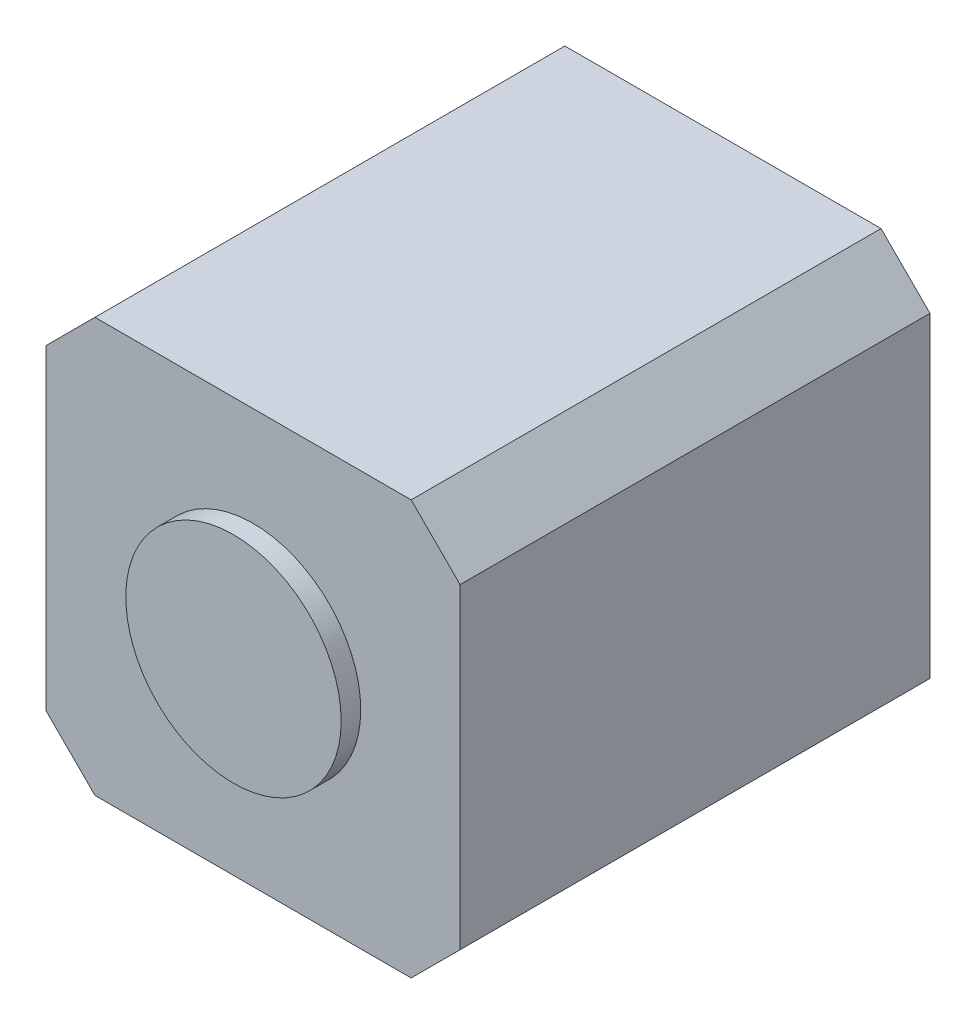
ISO-10303-21;
HEADER;
FILE_DESCRIPTION(('STEP AP214'),'2;1');
FILE_NAME('part.step','',(''),(''),'','','');
FILE_SCHEMA(('AUTOMOTIVE_DESIGN { 1 0 10303 214 1 1 1 1 }'));
ENDSEC;
DATA;
#1=APPLICATION_CONTEXT('core data for automotive mechanical design processes');
#2=APPLICATION_PROTOCOL_DEFINITION('international standard','automotive_design',2000,#1);
#3=PRODUCT_CONTEXT('',#1,'mechanical');
#4=PRODUCT('Part','Part','',(#3));
#5=PRODUCT_RELATED_PRODUCT_CATEGORY('part','',(#4));
#6=PRODUCT_DEFINITION_FORMATION('','',#4);
#7=PRODUCT_DEFINITION_CONTEXT('part definition',#1,'design');
#8=PRODUCT_DEFINITION('design','',#6,#7);
#9=PRODUCT_DEFINITION_SHAPE('','',#8);
#10=(LENGTH_UNIT() NAMED_UNIT(*) SI_UNIT(.MILLI.,.METRE.));
#11=(NAMED_UNIT(*) PLANE_ANGLE_UNIT() SI_UNIT($,.RADIAN.));
#12=(NAMED_UNIT(*) SI_UNIT($,.STERADIAN.) SOLID_ANGLE_UNIT());
#13=UNCERTAINTY_MEASURE_WITH_UNIT(LENGTH_MEASURE(1.E-05),#10,'distance_accuracy_value','');
#14=(GEOMETRIC_REPRESENTATION_CONTEXT(3) GLOBAL_UNCERTAINTY_ASSIGNED_CONTEXT((#13)) GLOBAL_UNIT_ASSIGNED_CONTEXT((#10,
#11,#12)) REPRESENTATION_CONTEXT('',''));
#15=CARTESIAN_POINT('',(0.,0.,0.));
#16=DIRECTION('',(0.,0.,1.));
#17=DIRECTION('',(1.,0.,0.));
#18=AXIS2_PLACEMENT_3D('',#15,#16,#17);
#19=CARTESIAN_POINT('',(0.,0.,48.));
#20=DIRECTION('',(1.,0.,0.));
#21=DIRECTION('',(0.,1.,0.));
#22=AXIS2_PLACEMENT_3D('',#19,#20,#21);
#23=PLANE('',#22);
#24=DIRECTION('',(0.,-1.,0.));
#25=VECTOR('',#24,1.);
#26=CARTESIAN_POINT('',(0.,0.,0.));
#27=LINE('',#26,#25);
#28=CARTESIAN_POINT('',(0.,-5.,0.));
#29=VERTEX_POINT('',#28);
#30=CARTESIAN_POINT('',(0.,-37.3,0.));
#31=VERTEX_POINT('',#30);
#32=EDGE_CURVE('E147',#29,#31,#27,.T.);
#33=ORIENTED_EDGE('',*,*,#32,.T.);
#34=DIRECTION('',(0.,0.,1.));
#35=VECTOR('',#34,1.);
#36=CARTESIAN_POINT('',(0.,-37.3,48.));
#37=LINE('',#36,#35);
#38=CARTESIAN_POINT('',(0.,-37.3,48.));
#39=VERTEX_POINT('',#38);
#40=EDGE_CURVE('E11',#31,#39,#37,.T.);
#41=ORIENTED_EDGE('',*,*,#40,.T.);
#42=DIRECTION('',(0.,-1.,0.));
#43=VECTOR('',#42,1.);
#44=CARTESIAN_POINT('',(0.,0.,48.));
#45=LINE('',#44,#43);
#46=CARTESIAN_POINT('',(0.,-5.,48.));
#47=VERTEX_POINT('',#46);
#48=EDGE_CURVE('E146',#47,#39,#45,.T.);
#49=ORIENTED_EDGE('',*,*,#48,.F.);
#50=DIRECTION('',(0.,0.,-1.));
#51=VECTOR('',#50,1.);
#52=CARTESIAN_POINT('',(0.,-5.,48.));
#53=LINE('',#52,#51);
#54=EDGE_CURVE('E60',#47,#29,#53,.T.);
#55=ORIENTED_EDGE('',*,*,#54,.T.);
#56=EDGE_LOOP('',(#33,#41,#49,#55));
#57=FACE_BOUND('',#56,.T.);
#58=ADVANCED_FACE('F50',(#57),#23,.F.);
#59=CARTESIAN_POINT('',(0.,-42.3,48.));
#60=DIRECTION('',(0.,1.,0.));
#61=DIRECTION('',(0.,0.,1.));
#62=AXIS2_PLACEMENT_3D('',#59,#60,#61);
#63=PLANE('',#62);
#64=DIRECTION('',(1.,0.,0.));
#65=VECTOR('',#64,1.);
#66=CARTESIAN_POINT('',(0.,-42.3,0.));
#67=LINE('',#66,#65);
#68=CARTESIAN_POINT('',(5.00000000000001,-42.3,0.));
#69=VERTEX_POINT('',#68);
#70=CARTESIAN_POINT('',(37.3,-42.3,0.));
#71=VERTEX_POINT('',#70);
#72=EDGE_CURVE('E145',#69,#71,#67,.T.);
#73=ORIENTED_EDGE('',*,*,#72,.T.);
#74=DIRECTION('',(0.,0.,1.));
#75=VECTOR('',#74,1.);
#76=CARTESIAN_POINT('',(37.3,-42.3,48.));
#77=LINE('',#76,#75);
#78=CARTESIAN_POINT('',(37.3,-42.3,48.));
#79=VERTEX_POINT('',#78);
#80=EDGE_CURVE('E117',#71,#79,#77,.T.);
#81=ORIENTED_EDGE('',*,*,#80,.T.);
#82=DIRECTION('',(1.,0.,0.));
#83=VECTOR('',#82,1.);
#84=CARTESIAN_POINT('',(0.,-42.3,48.));
#85=LINE('',#84,#83);
#86=CARTESIAN_POINT('',(5.00000000000001,-42.3,48.));
#87=VERTEX_POINT('',#86);
#88=EDGE_CURVE('E210',#87,#79,#85,.T.);
#89=ORIENTED_EDGE('',*,*,#88,.F.);
#90=DIRECTION('',(0.,0.,-1.));
#91=VECTOR('',#90,1.);
#92=CARTESIAN_POINT('',(5.00000000000001,-42.3,48.));
#93=LINE('',#92,#91);
#94=EDGE_CURVE('E127',#87,#69,#93,.T.);
#95=ORIENTED_EDGE('',*,*,#94,.T.);
#96=EDGE_LOOP('',(#73,#81,#89,#95));
#97=FACE_BOUND('',#96,.T.);
#98=ADVANCED_FACE('F230',(#97),#63,.F.);
#99=CARTESIAN_POINT('',(42.3,0.,48.));
#100=DIRECTION('',(-1.,0.,0.));
#101=DIRECTION('',(0.,-1.,0.));
#102=AXIS2_PLACEMENT_3D('',#99,#100,#101);
#103=PLANE('',#102);
#104=DIRECTION('',(0.,1.,0.));
#105=VECTOR('',#104,1.);
#106=CARTESIAN_POINT('',(42.3,0.,48.));
#107=LINE('',#106,#105);
#108=CARTESIAN_POINT('',(42.3,-37.3,48.));
#109=VERTEX_POINT('',#108);
#110=CARTESIAN_POINT('',(42.3,-5.00000000000002,48.));
#111=VERTEX_POINT('',#110);
#112=EDGE_CURVE('E132',#109,#111,#107,.T.);
#113=ORIENTED_EDGE('',*,*,#112,.F.);
#114=DIRECTION('',(0.,0.,-1.));
#115=VECTOR('',#114,1.);
#116=CARTESIAN_POINT('',(42.3,-37.3,48.));
#117=LINE('',#116,#115);
#118=CARTESIAN_POINT('',(42.3,-37.3,0.));
#119=VERTEX_POINT('',#118);
#120=EDGE_CURVE('E119',#109,#119,#117,.T.);
#121=ORIENTED_EDGE('',*,*,#120,.T.);
#122=DIRECTION('',(0.,1.,0.));
#123=VECTOR('',#122,1.);
#124=CARTESIAN_POINT('',(42.3,0.,0.));
#125=LINE('',#124,#123);
#126=CARTESIAN_POINT('',(42.3,-5.00000000000002,0.));
#127=VERTEX_POINT('',#126);
#128=EDGE_CURVE('E131',#119,#127,#125,.T.);
#129=ORIENTED_EDGE('',*,*,#128,.T.);
#130=DIRECTION('',(0.,0.,1.));
#131=VECTOR('',#130,1.);
#132=CARTESIAN_POINT('',(42.3,-5.00000000000002,48.));
#133=LINE('',#132,#131);
#134=EDGE_CURVE('E137',#127,#111,#133,.T.);
#135=ORIENTED_EDGE('',*,*,#134,.T.);
#136=EDGE_LOOP('',(#113,#121,#129,#135));
#137=FACE_BOUND('',#136,.T.);
#138=ADVANCED_FACE('F135',(#137),#103,.F.);
#139=CARTESIAN_POINT('',(0.,0.,48.));
#140=DIRECTION('',(0.,-1.,0.));
#141=DIRECTION('',(0.,0.,-1.));
#142=AXIS2_PLACEMENT_3D('',#139,#140,#141);
#143=PLANE('',#142);
#144=DIRECTION('',(-1.,0.,0.));
#145=VECTOR('',#144,1.);
#146=CARTESIAN_POINT('',(0.,0.,48.));
#147=LINE('',#146,#145);
#148=CARTESIAN_POINT('',(37.3,0.,48.));
#149=VERTEX_POINT('',#148);
#150=CARTESIAN_POINT('',(5.00000000000002,0.,48.));
#151=VERTEX_POINT('',#150);
#152=EDGE_CURVE('E205',#149,#151,#147,.T.);
#153=ORIENTED_EDGE('',*,*,#152,.F.);
#154=DIRECTION('',(0.,0.,-1.));
#155=VECTOR('',#154,1.);
#156=CARTESIAN_POINT('',(37.3,0.,48.));
#157=LINE('',#156,#155);
#158=CARTESIAN_POINT('',(37.3,0.,0.));
#159=VERTEX_POINT('',#158);
#160=EDGE_CURVE('E185',#149,#159,#157,.T.);
#161=ORIENTED_EDGE('',*,*,#160,.T.);
#162=DIRECTION('',(-1.,0.,0.));
#163=VECTOR('',#162,1.);
#164=CARTESIAN_POINT('',(0.,0.,0.));
#165=LINE('',#164,#163);
#166=CARTESIAN_POINT('',(5.00000000000002,0.,0.));
#167=VERTEX_POINT('',#166);
#168=EDGE_CURVE('E141',#159,#167,#165,.T.);
#169=ORIENTED_EDGE('',*,*,#168,.T.);
#170=DIRECTION('',(0.,0.,1.));
#171=VECTOR('',#170,1.);
#172=CARTESIAN_POINT('',(5.00000000000002,0.,48.));
#173=LINE('',#172,#171);
#174=EDGE_CURVE('E64',#167,#151,#173,.T.);
#175=ORIENTED_EDGE('',*,*,#174,.T.);
#176=EDGE_LOOP('',(#153,#161,#169,#175));
#177=FACE_BOUND('',#176,.T.);
#178=ADVANCED_FACE('F222',(#177),#143,.F.);
#179=CARTESIAN_POINT('',(0.,0.,48.));
#180=DIRECTION('',(0.,0.,1.));
#181=DIRECTION('',(1.,0.,0.));
#182=AXIS2_PLACEMENT_3D('',#179,#180,#181);
#183=PLANE('',#182);
#184=CARTESIAN_POINT('',(21.15,-21.15,48.));
#185=DIRECTION('',(0.,0.,1.));
#186=DIRECTION('',(1.,0.,0.));
#187=AXIS2_PLACEMENT_3D('',#184,#185,#186);
#188=CIRCLE('',#187,11.);
#189=CARTESIAN_POINT('',(32.15,-21.15,48.));
#190=VERTEX_POINT('',#189);
#191=EDGE_CURVE('E154',#190,#190,#188,.T.);
#192=ORIENTED_EDGE('',*,*,#191,.F.);
#193=EDGE_LOOP('',(#192));
#194=FACE_BOUND('',#193,.T.);
#195=ORIENTED_EDGE('',*,*,#88,.T.);
#196=DIRECTION('',(-0.70710678118655,-0.707106781186546,0.));
#197=VECTOR('',#196,1.);
#198=CARTESIAN_POINT('',(39.7999999999999,-39.8000000000001,48.));
#199=LINE('',#198,#197);
#200=EDGE_CURVE('E180',#79,#109,#199,.F.);
#201=ORIENTED_EDGE('',*,*,#200,.T.);
#202=ORIENTED_EDGE('',*,*,#112,.T.);
#203=DIRECTION('',(0.707106781186547,-0.707106781186548,0.));
#204=VECTOR('',#203,1.);
#205=CARTESIAN_POINT('',(18.65,18.65,48.));
#206=LINE('',#205,#204);
#207=EDGE_CURVE('E72',#111,#149,#206,.F.);
#208=ORIENTED_EDGE('',*,*,#207,.T.);
#209=ORIENTED_EDGE('',*,*,#152,.T.);
#210=DIRECTION('',(0.707106781186549,0.707106781186547,0.));
#211=VECTOR('',#210,1.);
#212=CARTESIAN_POINT('',(2.5,-2.50000000000001,48.));
#213=LINE('',#212,#211);
#214=EDGE_CURVE('E166',#151,#47,#213,.F.);
#215=ORIENTED_EDGE('',*,*,#214,.T.);
#216=ORIENTED_EDGE('',*,*,#48,.T.);
#217=DIRECTION('',(-0.707106781186547,0.707106781186548,0.));
#218=VECTOR('',#217,1.);
#219=CARTESIAN_POINT('',(-18.65,-18.65,48.));
#220=LINE('',#219,#218);
#221=EDGE_CURVE('E175',#39,#87,#220,.F.);
#222=ORIENTED_EDGE('',*,*,#221,.T.);
#223=EDGE_LOOP('',(#195,#201,#202,#208,#209,#215,#216,#222));
#224=FACE_BOUND('',#223,.T.);
#225=ADVANCED_FACE('F218',(#194,#224),#183,.T.);
#226=CARTESIAN_POINT('',(0.,0.,0.));
#227=DIRECTION('',(0.,0.,1.));
#228=DIRECTION('',(1.,0.,0.));
#229=AXIS2_PLACEMENT_3D('',#226,#227,#228);
#230=PLANE('',#229);
#231=ORIENTED_EDGE('',*,*,#128,.F.);
#232=DIRECTION('',(0.70710678118655,0.707106781186546,0.));
#233=VECTOR('',#232,1.);
#234=CARTESIAN_POINT('',(42.3,-37.3,0.));
#235=LINE('',#234,#233);
#236=EDGE_CURVE('E113',#119,#71,#235,.F.);
#237=ORIENTED_EDGE('',*,*,#236,.T.);
#238=ORIENTED_EDGE('',*,*,#72,.F.);
#239=DIRECTION('',(0.707106781186547,-0.707106781186548,0.));
#240=VECTOR('',#239,1.);
#241=CARTESIAN_POINT('',(5.00000000000001,-42.3,0.));
#242=LINE('',#241,#240);
#243=EDGE_CURVE('E157',#69,#31,#242,.F.);
#244=ORIENTED_EDGE('',*,*,#243,.T.);
#245=ORIENTED_EDGE('',*,*,#32,.F.);
#246=DIRECTION('',(-0.707106781186549,-0.707106781186547,0.));
#247=VECTOR('',#246,1.);
#248=CARTESIAN_POINT('',(0.,-5.,0.));
#249=LINE('',#248,#247);
#250=EDGE_CURVE('E140',#29,#167,#249,.F.);
#251=ORIENTED_EDGE('',*,*,#250,.T.);
#252=ORIENTED_EDGE('',*,*,#168,.F.);
#253=DIRECTION('',(-0.707106781186547,0.707106781186548,0.));
#254=VECTOR('',#253,1.);
#255=CARTESIAN_POINT('',(37.3,0.,0.));
#256=LINE('',#255,#254);
#257=EDGE_CURVE('E130',#159,#127,#256,.F.);
#258=ORIENTED_EDGE('',*,*,#257,.T.);
#259=EDGE_LOOP('',(#231,#237,#238,#244,#245,#251,#252,#258));
#260=FACE_BOUND('',#259,.T.);
#261=ADVANCED_FACE('F139',(#260),#230,.F.);
#262=CARTESIAN_POINT('',(21.15,-21.15,50.));
#263=DIRECTION('',(0.,0.,-1.));
#264=DIRECTION('',(-1.,0.,0.));
#265=AXIS2_PLACEMENT_3D('',#262,#263,#264);
#266=CYLINDRICAL_SURFACE('',#265,11.);
#267=CARTESIAN_POINT('',(21.15,-21.15,50.));
#268=DIRECTION('',(0.,0.,1.));
#269=DIRECTION('',(1.,0.,0.));
#270=AXIS2_PLACEMENT_3D('',#267,#268,#269);
#271=CIRCLE('',#270,11.);
#272=CARTESIAN_POINT('',(32.15,-21.15,50.));
#273=VERTEX_POINT('',#272);
#274=EDGE_CURVE('E197',#273,#273,#271,.T.);
#275=ORIENTED_EDGE('',*,*,#274,.F.);
#276=EDGE_LOOP('',(#275));
#277=FACE_BOUND('',#276,.T.);
#278=ORIENTED_EDGE('',*,*,#191,.T.);
#279=EDGE_LOOP('',(#278));
#280=FACE_BOUND('',#279,.T.);
#281=ADVANCED_FACE('F220',(#277,#280),#266,.T.);
#282=CARTESIAN_POINT('',(21.15,-21.15,50.));
#283=DIRECTION('',(0.,0.,1.));
#284=DIRECTION('',(1.,0.,0.));
#285=AXIS2_PLACEMENT_3D('',#282,#283,#284);
#286=PLANE('',#285);
#287=ORIENTED_EDGE('',*,*,#274,.T.);
#288=EDGE_LOOP('',(#287));
#289=FACE_BOUND('',#288,.T.);
#290=ADVANCED_FACE('F249',(#289),#286,.T.);
#291=CARTESIAN_POINT('',(42.3,-37.3,48.));
#292=DIRECTION('',(-0.707106781186546,0.70710678118655,0.));
#293=DIRECTION('',(0.,0.,-1.));
#294=AXIS2_PLACEMENT_3D('',#291,#292,#293);
#295=PLANE('',#294);
#296=ORIENTED_EDGE('',*,*,#200,.F.);
#297=ORIENTED_EDGE('',*,*,#80,.F.);
#298=ORIENTED_EDGE('',*,*,#236,.F.);
#299=ORIENTED_EDGE('',*,*,#120,.F.);
#300=EDGE_LOOP('',(#296,#297,#298,#299));
#301=FACE_BOUND('',#300,.T.);
#302=ADVANCED_FACE('F116',(#301),#295,.F.);
#303=CARTESIAN_POINT('',(37.3,0.,48.));
#304=DIRECTION('',(-0.707106781186548,-0.707106781186547,0.));
#305=DIRECTION('',(0.,0.,-1.));
#306=AXIS2_PLACEMENT_3D('',#303,#304,#305);
#307=PLANE('',#306);
#308=ORIENTED_EDGE('',*,*,#207,.F.);
#309=ORIENTED_EDGE('',*,*,#134,.F.);
#310=ORIENTED_EDGE('',*,*,#257,.F.);
#311=ORIENTED_EDGE('',*,*,#160,.F.);
#312=EDGE_LOOP('',(#308,#309,#310,#311));
#313=FACE_BOUND('',#312,.T.);
#314=ADVANCED_FACE('F233',(#313),#307,.F.);
#315=CARTESIAN_POINT('',(5.00000000000001,-42.3,48.));
#316=DIRECTION('',(0.707106781186548,0.707106781186547,0.));
#317=DIRECTION('',(0.,0.,-1.));
#318=AXIS2_PLACEMENT_3D('',#315,#316,#317);
#319=PLANE('',#318);
#320=ORIENTED_EDGE('',*,*,#221,.F.);
#321=ORIENTED_EDGE('',*,*,#40,.F.);
#322=ORIENTED_EDGE('',*,*,#243,.F.);
#323=ORIENTED_EDGE('',*,*,#94,.F.);
#324=EDGE_LOOP('',(#320,#321,#322,#323));
#325=FACE_BOUND('',#324,.T.);
#326=ADVANCED_FACE('F229',(#325),#319,.F.);
#327=CARTESIAN_POINT('',(0.,-5.,48.));
#328=DIRECTION('',(0.707106781186547,-0.707106781186549,0.));
#329=DIRECTION('',(0.,0.,-1.));
#330=AXIS2_PLACEMENT_3D('',#327,#328,#329);
#331=PLANE('',#330);
#332=ORIENTED_EDGE('',*,*,#214,.F.);
#333=ORIENTED_EDGE('',*,*,#174,.F.);
#334=ORIENTED_EDGE('',*,*,#250,.F.);
#335=ORIENTED_EDGE('',*,*,#54,.F.);
#336=EDGE_LOOP('',(#332,#333,#334,#335));
#337=FACE_BOUND('',#336,.T.);
#338=ADVANCED_FACE('F49',(#337),#331,.F.);
#339=CLOSED_SHELL('',(#58,#98,#138,#178,#225,#261,#281,#290,#302,#314,#326,#338));
#340=MANIFOLD_SOLID_BREP('B2',#339);
#341=ADVANCED_BREP_SHAPE_REPRESENTATION('',(#18,#340),#14);
#342=SHAPE_DEFINITION_REPRESENTATION(#9,#341);
ENDSEC;
END-ISO-10303-21;
